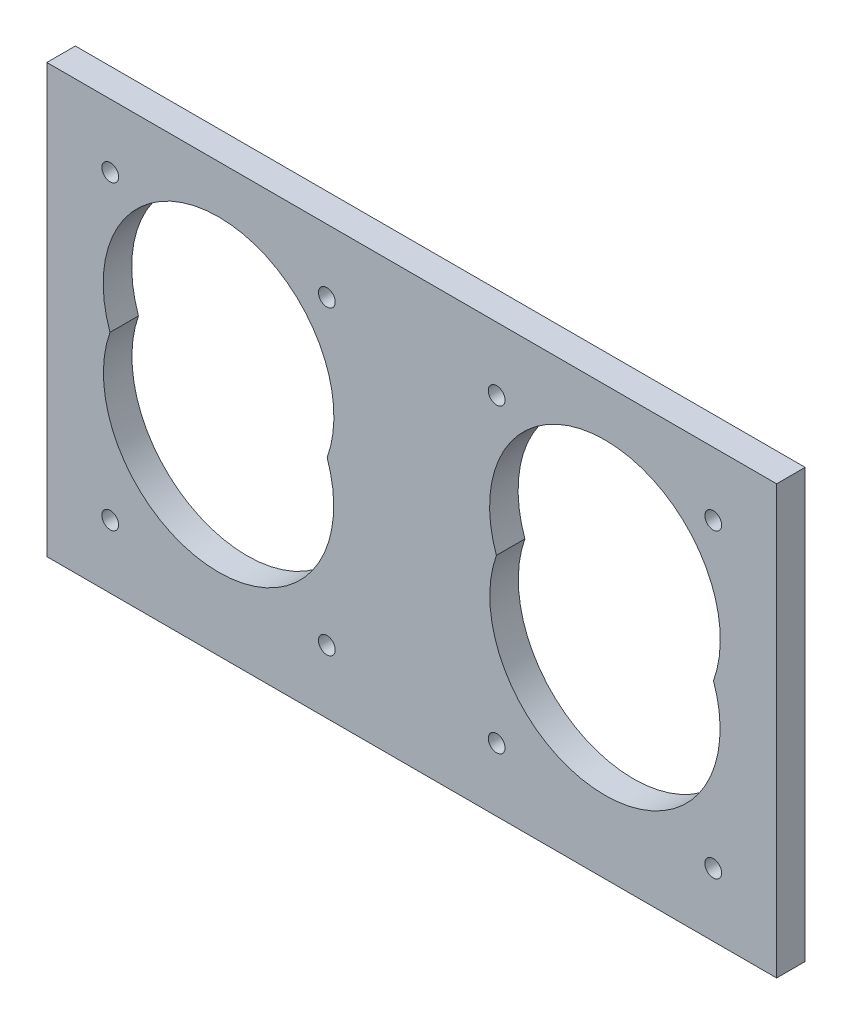
ISO-10303-21;
HEADER;
FILE_DESCRIPTION(('STEP AP214'),'2;1');
FILE_NAME('part.step','',(''),(''),'','','');
FILE_SCHEMA(('AUTOMOTIVE_DESIGN { 1 0 10303 214 1 1 1 1 }'));
ENDSEC;
DATA;
#1=APPLICATION_CONTEXT('core data for automotive mechanical design processes');
#2=APPLICATION_PROTOCOL_DEFINITION('international standard','automotive_design',2000,#1);
#3=PRODUCT_CONTEXT('',#1,'mechanical');
#4=PRODUCT('Part','Part','',(#3));
#5=PRODUCT_RELATED_PRODUCT_CATEGORY('part','',(#4));
#6=PRODUCT_DEFINITION_FORMATION('','',#4);
#7=PRODUCT_DEFINITION_CONTEXT('part definition',#1,'design');
#8=PRODUCT_DEFINITION('design','',#6,#7);
#9=PRODUCT_DEFINITION_SHAPE('','',#8);
#10=(LENGTH_UNIT() NAMED_UNIT(*) SI_UNIT(.MILLI.,.METRE.));
#11=(NAMED_UNIT(*) PLANE_ANGLE_UNIT() SI_UNIT($,.RADIAN.));
#12=(NAMED_UNIT(*) SI_UNIT($,.STERADIAN.) SOLID_ANGLE_UNIT());
#13=UNCERTAINTY_MEASURE_WITH_UNIT(LENGTH_MEASURE(1.E-05),#10,'distance_accuracy_value','');
#14=(GEOMETRIC_REPRESENTATION_CONTEXT(3) GLOBAL_UNCERTAINTY_ASSIGNED_CONTEXT((#13)) GLOBAL_UNIT_ASSIGNED_CONTEXT((#10,
#11,#12)) REPRESENTATION_CONTEXT('',''));
#15=CARTESIAN_POINT('',(0.,0.,0.));
#16=DIRECTION('',(0.,0.,1.));
#17=DIRECTION('',(1.,0.,0.));
#18=AXIS2_PLACEMENT_3D('',#15,#16,#17);
#19=CARTESIAN_POINT('',(-4.50000190126662,2.42973090307518,5.));
#20=DIRECTION('',(0.,0.,-1.));
#21=DIRECTION('',(-1.,0.,0.));
#22=AXIS2_PLACEMENT_3D('',#19,#20,#21);
#23=CYLINDRICAL_SURFACE('',#22,20.1998483211657);
#24=CARTESIAN_POINT('',(-4.50000190126662,2.42973090307518,0.));
#25=DIRECTION('',(0.,0.,1.));
#26=DIRECTION('',(1.,0.,0.));
#27=AXIS2_PLACEMENT_3D('',#24,#25,#26);
#28=CIRCLE('',#27,20.1998483211657);
#29=CARTESIAN_POINT('',(-23.5464817883785,9.15769315831589,0.));
#30=VERTEX_POINT('',#29);
#31=CARTESIAN_POINT('',(14.5464383030136,9.15780549710871,0.));
#32=VERTEX_POINT('',#31);
#33=EDGE_CURVE('E160',#30,#32,#28,.T.);
#34=ORIENTED_EDGE('',*,*,#33,.F.);
#35=DIRECTION('',(0.,0.,-1.));
#36=VECTOR('',#35,1.);
#37=CARTESIAN_POINT('',(-23.5464817883785,9.15769315831589,5.));
#38=LINE('',#37,#36);
#39=CARTESIAN_POINT('',(-23.5464817883785,9.15769315831589,5.));
#40=VERTEX_POINT('',#39);
#41=EDGE_CURVE('E11',#40,#30,#38,.T.);
#42=ORIENTED_EDGE('',*,*,#41,.F.);
#43=CARTESIAN_POINT('',(-4.50000190126662,2.42973090307518,5.));
#44=DIRECTION('',(0.,0.,1.));
#45=DIRECTION('',(1.,0.,0.));
#46=AXIS2_PLACEMENT_3D('',#43,#44,#45);
#47=CIRCLE('',#46,20.1998483211657);
#48=CARTESIAN_POINT('',(14.5464383030136,9.15780549710871,5.));
#49=VERTEX_POINT('',#48);
#50=EDGE_CURVE('E118',#40,#49,#47,.T.);
#51=ORIENTED_EDGE('',*,*,#50,.T.);
#52=DIRECTION('',(0.,0.,-1.));
#53=VECTOR('',#52,1.);
#54=CARTESIAN_POINT('',(14.5464383030136,9.15780549710871,5.));
#55=LINE('',#54,#53);
#56=EDGE_CURVE('E45',#49,#32,#55,.T.);
#57=ORIENTED_EDGE('',*,*,#56,.T.);
#58=EDGE_LOOP('',(#34,#42,#51,#57));
#59=FACE_BOUND('',#58,.T.);
#60=ADVANCED_FACE('F35',(#59),#23,.F.);
#61=CARTESIAN_POINT('',(0.,44.6200004768371,5.));
#62=DIRECTION('',(0.,1.,0.));
#63=DIRECTION('',(0.,0.,1.));
#64=AXIS2_PLACEMENT_3D('',#61,#62,#63);
#65=PLANE('',#64);
#66=DIRECTION('',(1.,0.,0.));
#67=VECTOR('',#66,1.);
#68=CARTESIAN_POINT('',(0.,44.6200004768371,0.));
#69=LINE('',#68,#67);
#70=CARTESIAN_POINT('',(-34.6200007003546,44.6200004768371,0.));
#71=VERTEX_POINT('',#70);
#72=CARTESIAN_POINT('',(93.404548556018,44.6200004768371,0.));
#73=VERTEX_POINT('',#72);
#74=EDGE_CURVE('E151',#71,#73,#69,.T.);
#75=ORIENTED_EDGE('',*,*,#74,.F.);
#76=DIRECTION('',(0.,0.,-1.));
#77=VECTOR('',#76,1.);
#78=CARTESIAN_POINT('',(-34.6200007003546,44.6200004768371,5.));
#79=LINE('',#78,#77);
#80=CARTESIAN_POINT('',(-34.6200007003546,44.6200004768371,5.));
#81=VERTEX_POINT('',#80);
#82=EDGE_CURVE('E130',#81,#71,#79,.T.);
#83=ORIENTED_EDGE('',*,*,#82,.F.);
#84=DIRECTION('',(1.,0.,0.));
#85=VECTOR('',#84,1.);
#86=CARTESIAN_POINT('',(0.,44.6200004768371,5.));
#87=LINE('',#86,#85);
#88=CARTESIAN_POINT('',(93.404548556018,44.6200004768371,5.));
#89=VERTEX_POINT('',#88);
#90=EDGE_CURVE('E111',#81,#89,#87,.T.);
#91=ORIENTED_EDGE('',*,*,#90,.T.);
#92=DIRECTION('',(0.,0.,-1.));
#93=VECTOR('',#92,1.);
#94=CARTESIAN_POINT('',(93.404548556018,44.6200004768371,5.));
#95=LINE('',#94,#93);
#96=EDGE_CURVE('E121',#89,#73,#95,.T.);
#97=ORIENTED_EDGE('',*,*,#96,.T.);
#98=EDGE_LOOP('',(#75,#83,#91,#97));
#99=FACE_BOUND('',#98,.T.);
#100=ADVANCED_FACE('F129',(#99),#65,.T.);
#101=CARTESIAN_POINT('',(-34.6200007003546,0.,5.));
#102=DIRECTION('',(-1.,0.,0.));
#103=DIRECTION('',(0.,0.,1.));
#104=AXIS2_PLACEMENT_3D('',#101,#102,#103);
#105=PLANE('',#104);
#106=DIRECTION('',(0.,1.,0.));
#107=VECTOR('',#106,1.);
#108=CARTESIAN_POINT('',(-34.6200007003546,0.,0.));
#109=LINE('',#108,#107);
#110=CARTESIAN_POINT('',(-34.6200007003546,-30.4650000286103,0.));
#111=VERTEX_POINT('',#110);
#112=EDGE_CURVE('E153',#111,#71,#109,.T.);
#113=ORIENTED_EDGE('',*,*,#112,.F.);
#114=DIRECTION('',(0.,0.,-1.));
#115=VECTOR('',#114,1.);
#116=CARTESIAN_POINT('',(-34.6200007003546,-30.4650000286103,5.));
#117=LINE('',#116,#115);
#118=CARTESIAN_POINT('',(-34.6200007003546,-30.4650000286103,5.));
#119=VERTEX_POINT('',#118);
#120=EDGE_CURVE('E167',#119,#111,#117,.T.);
#121=ORIENTED_EDGE('',*,*,#120,.F.);
#122=DIRECTION('',(0.,1.,0.));
#123=VECTOR('',#122,1.);
#124=CARTESIAN_POINT('',(-34.6200007003546,0.,5.));
#125=LINE('',#124,#123);
#126=EDGE_CURVE('E131',#119,#81,#125,.T.);
#127=ORIENTED_EDGE('',*,*,#126,.T.);
#128=ORIENTED_EDGE('',*,*,#82,.T.);
#129=EDGE_LOOP('',(#113,#121,#127,#128));
#130=FACE_BOUND('',#129,.T.);
#131=ADVANCED_FACE('F217',(#130),#105,.T.);
#132=CARTESIAN_POINT('',(0.,-30.4650000286103,5.));
#133=DIRECTION('',(0.,1.,0.));
#134=DIRECTION('',(0.,0.,1.));
#135=AXIS2_PLACEMENT_3D('',#132,#133,#134);
#136=PLANE('',#135);
#137=DIRECTION('',(1.,0.,0.));
#138=VECTOR('',#137,1.);
#139=CARTESIAN_POINT('',(0.,-30.4650000286103,0.));
#140=LINE('',#139,#138);
#141=CARTESIAN_POINT('',(93.404548556018,-30.4650000286103,0.));
#142=VERTEX_POINT('',#141);
#143=EDGE_CURVE('E156',#111,#142,#140,.T.);
#144=ORIENTED_EDGE('',*,*,#143,.T.);
#145=DIRECTION('',(0.,0.,-1.));
#146=VECTOR('',#145,1.);
#147=CARTESIAN_POINT('',(93.404548556018,-30.4650000286103,5.));
#148=LINE('',#147,#146);
#149=CARTESIAN_POINT('',(93.404548556018,-30.4650000286103,5.));
#150=VERTEX_POINT('',#149);
#151=EDGE_CURVE('E127',#150,#142,#148,.T.);
#152=ORIENTED_EDGE('',*,*,#151,.F.);
#153=DIRECTION('',(1.,0.,0.));
#154=VECTOR('',#153,1.);
#155=CARTESIAN_POINT('',(0.,-30.4650000286103,5.));
#156=LINE('',#155,#154);
#157=EDGE_CURVE('E114',#119,#150,#156,.T.);
#158=ORIENTED_EDGE('',*,*,#157,.F.);
#159=ORIENTED_EDGE('',*,*,#120,.T.);
#160=EDGE_LOOP('',(#144,#152,#158,#159));
#161=FACE_BOUND('',#160,.T.);
#162=ADVANCED_FACE('F226',(#161),#136,.F.);
#163=CARTESIAN_POINT('',(63.2845897595525,15.9942054839587,5.));
#164=DIRECTION('',(0.,0.,-1.));
#165=DIRECTION('',(-1.,0.,0.));
#166=AXIS2_PLACEMENT_3D('',#163,#164,#165);
#167=CYLINDRICAL_SURFACE('',#166,20.2362242785589);
#168=CARTESIAN_POINT('',(63.2845897595525,15.9942054839587,0.));
#169=DIRECTION('',(0.,0.,1.));
#170=DIRECTION('',(1.,0.,0.));
#171=AXIS2_PLACEMENT_3D('',#168,#169,#170);
#172=CIRCLE('',#171,20.2362242785589);
#173=CARTESIAN_POINT('',(82.3310296440419,9.15769315831588,0.));
#174=VERTEX_POINT('',#173);
#175=CARTESIAN_POINT('',(44.2381095526499,9.15780549710872,0.));
#176=VERTEX_POINT('',#175);
#177=EDGE_CURVE('E145',#174,#176,#172,.T.);
#178=ORIENTED_EDGE('',*,*,#177,.F.);
#179=DIRECTION('',(0.,0.,-1.));
#180=VECTOR('',#179,1.);
#181=CARTESIAN_POINT('',(82.3310296440419,9.15769315831588,5.));
#182=LINE('',#181,#180);
#183=CARTESIAN_POINT('',(82.3310296440419,9.15769315831588,5.));
#184=VERTEX_POINT('',#183);
#185=EDGE_CURVE('E88',#184,#174,#182,.T.);
#186=ORIENTED_EDGE('',*,*,#185,.F.);
#187=CARTESIAN_POINT('',(63.2845897595525,15.9942054839587,5.));
#188=DIRECTION('',(0.,0.,1.));
#189=DIRECTION('',(1.,0.,0.));
#190=AXIS2_PLACEMENT_3D('',#187,#188,#189);
#191=CIRCLE('',#190,20.2362242785589);
#192=CARTESIAN_POINT('',(44.2381095526499,9.15780549710872,5.));
#193=VERTEX_POINT('',#192);
#194=EDGE_CURVE('E136',#184,#193,#191,.T.);
#195=ORIENTED_EDGE('',*,*,#194,.T.);
#196=DIRECTION('',(0.,0.,-1.));
#197=VECTOR('',#196,1.);
#198=CARTESIAN_POINT('',(44.2381095526499,9.15780549710872,5.));
#199=LINE('',#198,#197);
#200=EDGE_CURVE('E144',#193,#176,#199,.T.);
#201=ORIENTED_EDGE('',*,*,#200,.T.);
#202=EDGE_LOOP('',(#178,#186,#195,#201));
#203=FACE_BOUND('',#202,.T.);
#204=ADVANCED_FACE('F37',(#203),#167,.F.);
#205=CARTESIAN_POINT('',(93.404548556018,0.,5.));
#206=DIRECTION('',(-1.,0.,0.));
#207=DIRECTION('',(0.,0.,1.));
#208=AXIS2_PLACEMENT_3D('',#205,#206,#207);
#209=PLANE('',#208);
#210=DIRECTION('',(0.,1.,0.));
#211=VECTOR('',#210,1.);
#212=CARTESIAN_POINT('',(93.404548556018,0.,0.));
#213=LINE('',#212,#211);
#214=EDGE_CURVE('E123',#142,#73,#213,.T.);
#215=ORIENTED_EDGE('',*,*,#214,.T.);
#216=ORIENTED_EDGE('',*,*,#96,.F.);
#217=DIRECTION('',(0.,1.,0.));
#218=VECTOR('',#217,1.);
#219=CARTESIAN_POINT('',(93.404548556018,0.,5.));
#220=LINE('',#219,#218);
#221=EDGE_CURVE('E105',#150,#89,#220,.T.);
#222=ORIENTED_EDGE('',*,*,#221,.F.);
#223=ORIENTED_EDGE('',*,*,#151,.T.);
#224=EDGE_LOOP('',(#215,#216,#222,#223));
#225=FACE_BOUND('',#224,.T.);
#226=ADVANCED_FACE('F122',(#225),#209,.F.);
#227=CARTESIAN_POINT('',(63.28454975693,2.42973090307519,5.));
#228=DIRECTION('',(0.,0.,-1.));
#229=DIRECTION('',(-1.,0.,0.));
#230=AXIS2_PLACEMENT_3D('',#227,#228,#229);
#231=CYLINDRICAL_SURFACE('',#230,20.1998483211657);
#232=CARTESIAN_POINT('',(63.28454975693,2.42973090307519,0.));
#233=DIRECTION('',(0.,0.,1.));
#234=DIRECTION('',(1.,0.,0.));
#235=AXIS2_PLACEMENT_3D('',#232,#233,#234);
#236=CIRCLE('',#235,20.1998483211657);
#237=EDGE_CURVE('E148',#176,#174,#236,.T.);
#238=ORIENTED_EDGE('',*,*,#237,.F.);
#239=ORIENTED_EDGE('',*,*,#200,.F.);
#240=CARTESIAN_POINT('',(63.28454975693,2.42973090307519,5.));
#241=DIRECTION('',(0.,0.,1.));
#242=DIRECTION('',(1.,0.,0.));
#243=AXIS2_PLACEMENT_3D('',#240,#241,#242);
#244=CIRCLE('',#243,20.1998483211657);
#245=EDGE_CURVE('E132',#193,#184,#244,.T.);
#246=ORIENTED_EDGE('',*,*,#245,.T.);
#247=ORIENTED_EDGE('',*,*,#185,.T.);
#248=EDGE_LOOP('',(#238,#239,#246,#247));
#249=FACE_BOUND('',#248,.T.);
#250=ADVANCED_FACE('F225',(#249),#231,.F.);
#251=CARTESIAN_POINT('',(-4.50004190388904,15.9942054839587,5.));
#252=DIRECTION('',(0.,0.,-1.));
#253=DIRECTION('',(-1.,0.,0.));
#254=AXIS2_PLACEMENT_3D('',#251,#252,#253);
#255=CYLINDRICAL_SURFACE('',#254,20.2362242785589);
#256=CARTESIAN_POINT('',(-4.50004190388904,15.9942054839587,0.));
#257=DIRECTION('',(0.,0.,1.));
#258=DIRECTION('',(1.,0.,0.));
#259=AXIS2_PLACEMENT_3D('',#256,#257,#258);
#260=CIRCLE('',#259,20.2362242785589);
#261=EDGE_CURVE('E162',#32,#30,#260,.T.);
#262=ORIENTED_EDGE('',*,*,#261,.F.);
#263=ORIENTED_EDGE('',*,*,#56,.F.);
#264=CARTESIAN_POINT('',(-4.50004190388904,15.9942054839587,5.));
#265=DIRECTION('',(0.,0.,1.));
#266=DIRECTION('',(1.,0.,0.));
#267=AXIS2_PLACEMENT_3D('',#264,#265,#266);
#268=CIRCLE('',#267,20.2362242785589);
#269=EDGE_CURVE('E142',#49,#40,#268,.T.);
#270=ORIENTED_EDGE('',*,*,#269,.T.);
#271=ORIENTED_EDGE('',*,*,#41,.T.);
#272=EDGE_LOOP('',(#262,#263,#270,#271));
#273=FACE_BOUND('',#272,.T.);
#274=ADVANCED_FACE('F221',(#273),#255,.F.);
#275=CARTESIAN_POINT('',(0.,0.,5.));
#276=DIRECTION('',(0.,0.,1.));
#277=DIRECTION('',(1.,0.,0.));
#278=AXIS2_PLACEMENT_3D('',#275,#276,#277);
#279=PLANE('',#278);
#280=CARTESIAN_POINT('',(44.2848296858068,-19.345328378687,5.));
#281=DIRECTION('',(0.,0.,1.));
#282=DIRECTION('',(1.,0.,0.));
#283=AXIS2_PLACEMENT_3D('',#280,#281,#282);
#284=CIRCLE('',#283,1.4732);
#285=CARTESIAN_POINT('',(45.7580296858068,-19.345328378687,5.));
#286=VERTEX_POINT('',#285);
#287=EDGE_CURVE('E307',#286,#286,#284,.T.);
#288=ORIENTED_EDGE('',*,*,#287,.F.);
#289=EDGE_LOOP('',(#288));
#290=FACE_BOUND('',#289,.T.);
#291=CARTESIAN_POINT('',(14.5004063792218,-19.3447278658598,5.));
#292=DIRECTION('',(0.,0.,1.));
#293=DIRECTION('',(1.,0.,0.));
#294=AXIS2_PLACEMENT_3D('',#291,#292,#293);
#295=CIRCLE('',#294,1.4732);
#296=CARTESIAN_POINT('',(15.9736063792218,-19.3447278658598,5.));
#297=VERTEX_POINT('',#296);
#298=EDGE_CURVE('E303',#297,#297,#295,.T.);
#299=ORIENTED_EDGE('',*,*,#298,.F.);
#300=EDGE_LOOP('',(#299));
#301=FACE_BOUND('',#300,.T.);
#302=CARTESIAN_POINT('',(-23.4995935395913,-19.345440441422,5.));
#303=DIRECTION('',(0.,0.,1.));
#304=DIRECTION('',(1.,0.,0.));
#305=AXIS2_PLACEMENT_3D('',#302,#303,#304);
#306=CIRCLE('',#305,1.4732);
#307=CARTESIAN_POINT('',(-22.0263935395913,-19.345440441422,5.));
#308=VERTEX_POINT('',#307);
#309=EDGE_CURVE('E306',#308,#308,#306,.T.);
#310=ORIENTED_EDGE('',*,*,#309,.F.);
#311=EDGE_LOOP('',(#310));
#312=FACE_BOUND('',#311,.T.);
#313=CARTESIAN_POINT('',(14.4994154303793,33.5002726302965,5.));
#314=DIRECTION('',(0.,0.,1.));
#315=DIRECTION('',(1.,0.,0.));
#316=AXIS2_PLACEMENT_3D('',#313,#314,#315);
#317=CIRCLE('',#316,1.4732);
#318=CARTESIAN_POINT('',(15.9726154303793,33.5002726302965,5.));
#319=VERTEX_POINT('',#318);
#320=EDGE_CURVE('E271',#319,#319,#317,.T.);
#321=ORIENTED_EDGE('',*,*,#320,.F.);
#322=EDGE_LOOP('',(#321));
#323=FACE_BOUND('',#322,.T.);
#324=CARTESIAN_POINT('',(44.2841504244668,33.4996721223948,5.));
#325=DIRECTION('',(0.,0.,1.));
#326=DIRECTION('',(1.,0.,0.));
#327=AXIS2_PLACEMENT_3D('',#324,#325,#326);
#328=CIRCLE('',#327,1.4732);
#329=CARTESIAN_POINT('',(45.7573504244668,33.4996721223948,5.));
#330=VERTEX_POINT('',#329);
#331=EDGE_CURVE('E299',#330,#330,#328,.T.);
#332=ORIENTED_EDGE('',*,*,#331,.F.);
#333=EDGE_LOOP('',(#332));
#334=FACE_BOUND('',#333,.T.);
#335=CARTESIAN_POINT('',(82.2841503468217,33.500160568428,5.));
#336=DIRECTION('',(0.,0.,1.));
#337=DIRECTION('',(1.,0.,0.));
#338=AXIS2_PLACEMENT_3D('',#335,#336,#337);
#339=CIRCLE('',#338,1.4732);
#340=CARTESIAN_POINT('',(83.7573503468218,33.500160568428,5.));
#341=VERTEX_POINT('',#340);
#342=EDGE_CURVE('E296',#341,#341,#339,.T.);
#343=ORIENTED_EDGE('',*,*,#342,.F.);
#344=EDGE_LOOP('',(#343));
#345=FACE_BOUND('',#344,.T.);
#346=CARTESIAN_POINT('',(82.2848296081617,-19.3448399326539,5.));
#347=DIRECTION('',(0.,0.,1.));
#348=DIRECTION('',(1.,0.,0.));
#349=AXIS2_PLACEMENT_3D('',#346,#347,#348);
#350=CIRCLE('',#349,1.4732);
#351=CARTESIAN_POINT('',(83.7580296081617,-19.3448399326539,5.));
#352=VERTEX_POINT('',#351);
#353=EDGE_CURVE('E294',#352,#352,#350,.T.);
#354=ORIENTED_EDGE('',*,*,#353,.F.);
#355=EDGE_LOOP('',(#354));
#356=FACE_BOUND('',#355,.T.);
#357=CARTESIAN_POINT('',(-23.5005844884338,33.4995600547343,5.));
#358=DIRECTION('',(0.,0.,1.));
#359=DIRECTION('',(1.,0.,0.));
#360=AXIS2_PLACEMENT_3D('',#357,#358,#359);
#361=CIRCLE('',#360,1.4732);
#362=CARTESIAN_POINT('',(-22.0273844884338,33.4995600547343,5.));
#363=VERTEX_POINT('',#362);
#364=EDGE_CURVE('E176',#363,#363,#361,.T.);
#365=ORIENTED_EDGE('',*,*,#364,.F.);
#366=EDGE_LOOP('',(#365));
#367=FACE_BOUND('',#366,.T.);
#368=ORIENTED_EDGE('',*,*,#194,.F.);
#369=ORIENTED_EDGE('',*,*,#245,.F.);
#370=EDGE_LOOP('',(#368,#369));
#371=FACE_BOUND('',#370,.T.);
#372=ORIENTED_EDGE('',*,*,#90,.F.);
#373=ORIENTED_EDGE('',*,*,#126,.F.);
#374=ORIENTED_EDGE('',*,*,#157,.T.);
#375=ORIENTED_EDGE('',*,*,#221,.T.);
#376=EDGE_LOOP('',(#372,#373,#374,#375));
#377=FACE_BOUND('',#376,.T.);
#378=ORIENTED_EDGE('',*,*,#50,.F.);
#379=ORIENTED_EDGE('',*,*,#269,.F.);
#380=EDGE_LOOP('',(#378,#379));
#381=FACE_BOUND('',#380,.T.);
#382=ADVANCED_FACE('F107',(#290,#301,#312,#323,#334,#345,#356,#367,#371,#377,#381),#279,.T.);
#383=CARTESIAN_POINT('',(0.,0.,0.));
#384=DIRECTION('',(0.,0.,1.));
#385=DIRECTION('',(1.,0.,0.));
#386=AXIS2_PLACEMENT_3D('',#383,#384,#385);
#387=PLANE('',#386);
#388=CARTESIAN_POINT('',(44.2848296858068,-19.345328378687,0.));
#389=DIRECTION('',(0.,0.,1.));
#390=DIRECTION('',(1.,0.,0.));
#391=AXIS2_PLACEMENT_3D('',#388,#389,#390);
#392=CIRCLE('',#391,1.4732);
#393=CARTESIAN_POINT('',(45.7580296858068,-19.345328378687,0.));
#394=VERTEX_POINT('',#393);
#395=EDGE_CURVE('E39',#394,#394,#392,.T.);
#396=ORIENTED_EDGE('',*,*,#395,.T.);
#397=EDGE_LOOP('',(#396));
#398=FACE_BOUND('',#397,.T.);
#399=CARTESIAN_POINT('',(14.5004063792218,-19.3447278658598,0.));
#400=DIRECTION('',(0.,0.,1.));
#401=DIRECTION('',(1.,0.,0.));
#402=AXIS2_PLACEMENT_3D('',#399,#400,#401);
#403=CIRCLE('',#402,1.4732);
#404=CARTESIAN_POINT('',(15.9736063792218,-19.3447278658598,0.));
#405=VERTEX_POINT('',#404);
#406=EDGE_CURVE('E190',#405,#405,#403,.T.);
#407=ORIENTED_EDGE('',*,*,#406,.T.);
#408=EDGE_LOOP('',(#407));
#409=FACE_BOUND('',#408,.T.);
#410=CARTESIAN_POINT('',(-23.4995935395913,-19.345440441422,0.));
#411=DIRECTION('',(0.,0.,1.));
#412=DIRECTION('',(1.,0.,0.));
#413=AXIS2_PLACEMENT_3D('',#410,#411,#412);
#414=CIRCLE('',#413,1.4732);
#415=CARTESIAN_POINT('',(-22.0263935395913,-19.345440441422,0.));
#416=VERTEX_POINT('',#415);
#417=EDGE_CURVE('E188',#416,#416,#414,.T.);
#418=ORIENTED_EDGE('',*,*,#417,.T.);
#419=EDGE_LOOP('',(#418));
#420=FACE_BOUND('',#419,.T.);
#421=CARTESIAN_POINT('',(14.4994154303793,33.5002726302965,0.));
#422=DIRECTION('',(0.,0.,1.));
#423=DIRECTION('',(1.,0.,0.));
#424=AXIS2_PLACEMENT_3D('',#421,#422,#423);
#425=CIRCLE('',#424,1.4732);
#426=CARTESIAN_POINT('',(15.9726154303793,33.5002726302965,0.));
#427=VERTEX_POINT('',#426);
#428=EDGE_CURVE('E185',#427,#427,#425,.T.);
#429=ORIENTED_EDGE('',*,*,#428,.T.);
#430=EDGE_LOOP('',(#429));
#431=FACE_BOUND('',#430,.T.);
#432=CARTESIAN_POINT('',(44.2841504244668,33.4996721223948,0.));
#433=DIRECTION('',(0.,0.,1.));
#434=DIRECTION('',(1.,0.,0.));
#435=AXIS2_PLACEMENT_3D('',#432,#433,#434);
#436=CIRCLE('',#435,1.4732);
#437=CARTESIAN_POINT('',(45.7573504244668,33.4996721223948,0.));
#438=VERTEX_POINT('',#437);
#439=EDGE_CURVE('E182',#438,#438,#436,.T.);
#440=ORIENTED_EDGE('',*,*,#439,.T.);
#441=EDGE_LOOP('',(#440));
#442=FACE_BOUND('',#441,.T.);
#443=CARTESIAN_POINT('',(82.2841503468217,33.500160568428,0.));
#444=DIRECTION('',(0.,0.,1.));
#445=DIRECTION('',(1.,0.,0.));
#446=AXIS2_PLACEMENT_3D('',#443,#444,#445);
#447=CIRCLE('',#446,1.4732);
#448=CARTESIAN_POINT('',(83.7573503468218,33.500160568428,0.));
#449=VERTEX_POINT('',#448);
#450=EDGE_CURVE('E179',#449,#449,#447,.T.);
#451=ORIENTED_EDGE('',*,*,#450,.T.);
#452=EDGE_LOOP('',(#451));
#453=FACE_BOUND('',#452,.T.);
#454=CARTESIAN_POINT('',(82.2848296081617,-19.3448399326539,0.));
#455=DIRECTION('',(0.,0.,1.));
#456=DIRECTION('',(1.,0.,0.));
#457=AXIS2_PLACEMENT_3D('',#454,#455,#456);
#458=CIRCLE('',#457,1.4732);
#459=CARTESIAN_POINT('',(83.7580296081617,-19.3448399326539,0.));
#460=VERTEX_POINT('',#459);
#461=EDGE_CURVE('E175',#460,#460,#458,.T.);
#462=ORIENTED_EDGE('',*,*,#461,.T.);
#463=EDGE_LOOP('',(#462));
#464=FACE_BOUND('',#463,.T.);
#465=CARTESIAN_POINT('',(-23.5005844884338,33.4995600547343,0.));
#466=DIRECTION('',(0.,0.,1.));
#467=DIRECTION('',(1.,0.,0.));
#468=AXIS2_PLACEMENT_3D('',#465,#466,#467);
#469=CIRCLE('',#468,1.4732);
#470=CARTESIAN_POINT('',(-22.0273844884338,33.4995600547343,0.));
#471=VERTEX_POINT('',#470);
#472=EDGE_CURVE('E172',#471,#471,#469,.T.);
#473=ORIENTED_EDGE('',*,*,#472,.T.);
#474=EDGE_LOOP('',(#473));
#475=FACE_BOUND('',#474,.T.);
#476=ORIENTED_EDGE('',*,*,#177,.T.);
#477=ORIENTED_EDGE('',*,*,#237,.T.);
#478=EDGE_LOOP('',(#476,#477));
#479=FACE_BOUND('',#478,.T.);
#480=ORIENTED_EDGE('',*,*,#74,.T.);
#481=ORIENTED_EDGE('',*,*,#214,.F.);
#482=ORIENTED_EDGE('',*,*,#143,.F.);
#483=ORIENTED_EDGE('',*,*,#112,.T.);
#484=EDGE_LOOP('',(#480,#481,#482,#483));
#485=FACE_BOUND('',#484,.T.);
#486=ORIENTED_EDGE('',*,*,#33,.T.);
#487=ORIENTED_EDGE('',*,*,#261,.T.);
#488=EDGE_LOOP('',(#486,#487));
#489=FACE_BOUND('',#488,.T.);
#490=ADVANCED_FACE('F197',(#398,#409,#420,#431,#442,#453,#464,#475,#479,#485,#489),#387,.F.);
#491=CARTESIAN_POINT('',(-23.5005844884338,33.4995600547343,-5.));
#492=DIRECTION('',(0.,0.,1.));
#493=DIRECTION('',(1.,0.,0.));
#494=AXIS2_PLACEMENT_3D('',#491,#492,#493);
#495=CYLINDRICAL_SURFACE('',#494,1.4732);
#496=ORIENTED_EDGE('',*,*,#364,.T.);
#497=EDGE_LOOP('',(#496));
#498=FACE_BOUND('',#497,.T.);
#499=ORIENTED_EDGE('',*,*,#472,.F.);
#500=EDGE_LOOP('',(#499));
#501=FACE_BOUND('',#500,.T.);
#502=ADVANCED_FACE('F248',(#498,#501),#495,.F.);
#503=CARTESIAN_POINT('',(82.2848296081617,-19.3448399326539,-5.));
#504=DIRECTION('',(0.,0.,1.));
#505=DIRECTION('',(1.,0.,0.));
#506=AXIS2_PLACEMENT_3D('',#503,#504,#505);
#507=CYLINDRICAL_SURFACE('',#506,1.4732);
#508=ORIENTED_EDGE('',*,*,#353,.T.);
#509=EDGE_LOOP('',(#508));
#510=FACE_BOUND('',#509,.T.);
#511=ORIENTED_EDGE('',*,*,#461,.F.);
#512=EDGE_LOOP('',(#511));
#513=FACE_BOUND('',#512,.T.);
#514=ADVANCED_FACE('F254',(#510,#513),#507,.F.);
#515=CARTESIAN_POINT('',(82.2841503468217,33.500160568428,-5.));
#516=DIRECTION('',(0.,0.,1.));
#517=DIRECTION('',(1.,0.,0.));
#518=AXIS2_PLACEMENT_3D('',#515,#516,#517);
#519=CYLINDRICAL_SURFACE('',#518,1.4732);
#520=ORIENTED_EDGE('',*,*,#342,.T.);
#521=EDGE_LOOP('',(#520));
#522=FACE_BOUND('',#521,.T.);
#523=ORIENTED_EDGE('',*,*,#450,.F.);
#524=EDGE_LOOP('',(#523));
#525=FACE_BOUND('',#524,.T.);
#526=ADVANCED_FACE('F265',(#522,#525),#519,.F.);
#527=CARTESIAN_POINT('',(44.2841504244668,33.4996721223948,-5.));
#528=DIRECTION('',(0.,0.,1.));
#529=DIRECTION('',(1.,0.,0.));
#530=AXIS2_PLACEMENT_3D('',#527,#528,#529);
#531=CYLINDRICAL_SURFACE('',#530,1.4732);
#532=ORIENTED_EDGE('',*,*,#331,.T.);
#533=EDGE_LOOP('',(#532));
#534=FACE_BOUND('',#533,.T.);
#535=ORIENTED_EDGE('',*,*,#439,.F.);
#536=EDGE_LOOP('',(#535));
#537=FACE_BOUND('',#536,.T.);
#538=ADVANCED_FACE('F260',(#534,#537),#531,.F.);
#539=CARTESIAN_POINT('',(14.4994154303793,33.5002726302965,-5.));
#540=DIRECTION('',(0.,0.,1.));
#541=DIRECTION('',(1.,0.,0.));
#542=AXIS2_PLACEMENT_3D('',#539,#540,#541);
#543=CYLINDRICAL_SURFACE('',#542,1.4732);
#544=ORIENTED_EDGE('',*,*,#320,.T.);
#545=EDGE_LOOP('',(#544));
#546=FACE_BOUND('',#545,.T.);
#547=ORIENTED_EDGE('',*,*,#428,.F.);
#548=EDGE_LOOP('',(#547));
#549=FACE_BOUND('',#548,.T.);
#550=ADVANCED_FACE('F257',(#546,#549),#543,.F.);
#551=CARTESIAN_POINT('',(-23.4995935395913,-19.345440441422,-5.));
#552=DIRECTION('',(0.,0.,1.));
#553=DIRECTION('',(1.,0.,0.));
#554=AXIS2_PLACEMENT_3D('',#551,#552,#553);
#555=CYLINDRICAL_SURFACE('',#554,1.4732);
#556=ORIENTED_EDGE('',*,*,#309,.T.);
#557=EDGE_LOOP('',(#556));
#558=FACE_BOUND('',#557,.T.);
#559=ORIENTED_EDGE('',*,*,#417,.F.);
#560=EDGE_LOOP('',(#559));
#561=FACE_BOUND('',#560,.T.);
#562=ADVANCED_FACE('F207',(#558,#561),#555,.F.);
#563=CARTESIAN_POINT('',(14.5004063792218,-19.3447278658598,-5.));
#564=DIRECTION('',(0.,0.,1.));
#565=DIRECTION('',(1.,0.,0.));
#566=AXIS2_PLACEMENT_3D('',#563,#564,#565);
#567=CYLINDRICAL_SURFACE('',#566,1.4732);
#568=ORIENTED_EDGE('',*,*,#298,.T.);
#569=EDGE_LOOP('',(#568));
#570=FACE_BOUND('',#569,.T.);
#571=ORIENTED_EDGE('',*,*,#406,.F.);
#572=EDGE_LOOP('',(#571));
#573=FACE_BOUND('',#572,.T.);
#574=ADVANCED_FACE('F201',(#570,#573),#567,.F.);
#575=CARTESIAN_POINT('',(44.2848296858068,-19.345328378687,-5.));
#576=DIRECTION('',(0.,0.,1.));
#577=DIRECTION('',(1.,0.,0.));
#578=AXIS2_PLACEMENT_3D('',#575,#576,#577);
#579=CYLINDRICAL_SURFACE('',#578,1.4732);
#580=ORIENTED_EDGE('',*,*,#287,.T.);
#581=EDGE_LOOP('',(#580));
#582=FACE_BOUND('',#581,.T.);
#583=ORIENTED_EDGE('',*,*,#395,.F.);
#584=EDGE_LOOP('',(#583));
#585=FACE_BOUND('',#584,.T.);
#586=ADVANCED_FACE('F199',(#582,#585),#579,.F.);
#587=CLOSED_SHELL('',(#60,#100,#131,#162,#204,#226,#250,#274,#382,#490,#502,#514,#526,#538,#550,
#562,#574,#586));
#588=MANIFOLD_SOLID_BREP('B2',#587);
#589=ADVANCED_BREP_SHAPE_REPRESENTATION('',(#18,#588),#14);
#590=SHAPE_DEFINITION_REPRESENTATION(#9,#589);
ENDSEC;
END-ISO-10303-21;
